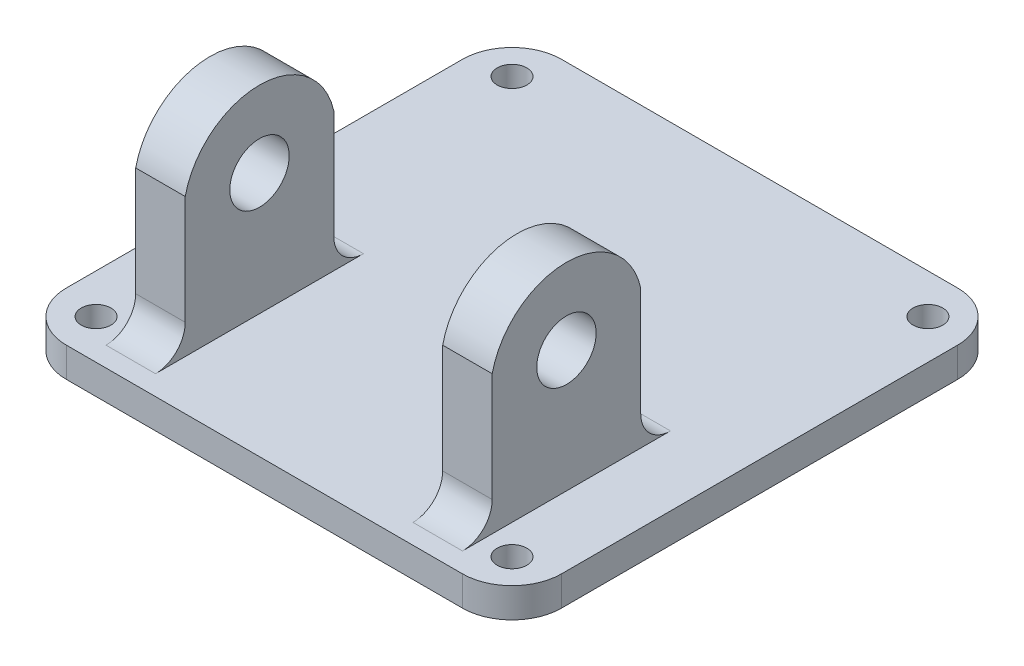
ISO-10303-21;
HEADER;
FILE_DESCRIPTION(('STEP AP214'),'2;1');
FILE_NAME('part.step','',(''),(''),'','','');
FILE_SCHEMA(('AUTOMOTIVE_DESIGN { 1 0 10303 214 1 1 1 1 }'));
ENDSEC;
DATA;
#1=APPLICATION_CONTEXT('core data for automotive mechanical design processes');
#2=APPLICATION_PROTOCOL_DEFINITION('international standard','automotive_design',2000,#1);
#3=PRODUCT_CONTEXT('',#1,'mechanical');
#4=PRODUCT('Part','Part','',(#3));
#5=PRODUCT_RELATED_PRODUCT_CATEGORY('part','',(#4));
#6=PRODUCT_DEFINITION_FORMATION('','',#4);
#7=PRODUCT_DEFINITION_CONTEXT('part definition',#1,'design');
#8=PRODUCT_DEFINITION('design','',#6,#7);
#9=PRODUCT_DEFINITION_SHAPE('','',#8);
#10=(LENGTH_UNIT() NAMED_UNIT(*) SI_UNIT(.MILLI.,.METRE.));
#11=(NAMED_UNIT(*) PLANE_ANGLE_UNIT() SI_UNIT($,.RADIAN.));
#12=(NAMED_UNIT(*) SI_UNIT($,.STERADIAN.) SOLID_ANGLE_UNIT());
#13=UNCERTAINTY_MEASURE_WITH_UNIT(LENGTH_MEASURE(1.E-05),#10,'distance_accuracy_value','');
#14=(GEOMETRIC_REPRESENTATION_CONTEXT(3) GLOBAL_UNCERTAINTY_ASSIGNED_CONTEXT((#13)) GLOBAL_UNIT_ASSIGNED_CONTEXT((#10,
#11,#12)) REPRESENTATION_CONTEXT('',''));
#15=CARTESIAN_POINT('',(0.,0.,0.));
#16=DIRECTION('',(0.,0.,1.));
#17=DIRECTION('',(1.,0.,0.));
#18=AXIS2_PLACEMENT_3D('',#15,#16,#17);
#19=CARTESIAN_POINT('',(13.,6.,2.));
#20=DIRECTION('',(1.,0.,0.));
#21=DIRECTION('',(0.,0.,-1.));
#22=AXIS2_PLACEMENT_3D('',#19,#20,#21);
#23=CYLINDRICAL_SURFACE('',#22,3.);
#24=DIRECTION('',(-1.,0.,0.));
#25=VECTOR('',#24,1.);
#26=CARTESIAN_POINT('',(13.,6.,5.));
#27=LINE('',#26,#25);
#28=CARTESIAN_POINT('',(18.,6.,5.));
#29=VERTEX_POINT('',#28);
#30=CARTESIAN_POINT('',(13.,6.,5.));
#31=VERTEX_POINT('',#30);
#32=EDGE_CURVE('E635',#29,#31,#27,.T.);
#33=ORIENTED_EDGE('',*,*,#32,.F.);
#34=CARTESIAN_POINT('',(18.,6.,2.));
#35=DIRECTION('',(-1.,0.,0.));
#36=DIRECTION('',(0.,0.,1.));
#37=AXIS2_PLACEMENT_3D('',#34,#35,#36);
#38=CIRCLE('',#37,3.);
#39=CARTESIAN_POINT('',(18.,3.,2.));
#40=VERTEX_POINT('',#39);
#41=EDGE_CURVE('E56',#29,#40,#38,.F.);
#42=ORIENTED_EDGE('',*,*,#41,.T.);
#43=DIRECTION('',(-1.,0.,0.));
#44=VECTOR('',#43,1.);
#45=CARTESIAN_POINT('',(13.,3.,2.));
#46=LINE('',#45,#44);
#47=CARTESIAN_POINT('',(13.,3.,2.));
#48=VERTEX_POINT('',#47);
#49=EDGE_CURVE('E637',#48,#40,#46,.F.);
#50=ORIENTED_EDGE('',*,*,#49,.F.);
#51=CARTESIAN_POINT('',(13.,6.,2.));
#52=DIRECTION('',(1.,0.,0.));
#53=DIRECTION('',(0.,0.,-1.));
#54=AXIS2_PLACEMENT_3D('',#51,#52,#53);
#55=CIRCLE('',#54,3.);
#56=EDGE_CURVE('E12',#48,#31,#55,.F.);
#57=ORIENTED_EDGE('',*,*,#56,.T.);
#58=EDGE_LOOP('',(#33,#42,#50,#57));
#59=FACE_BOUND('',#58,.T.);
#60=ADVANCED_FACE('F49',(#59),#23,.F.);
#61=CARTESIAN_POINT('',(8.00000000000007,6.,20.));
#62=CARTESIAN_POINT('',(9.66666666666689,6.,20.));
#63=CARTESIAN_POINT('',(11.3333333333331,6.,20.));
#64=CARTESIAN_POINT('',(14.6666666666669,6.,20.));
#65=CARTESIAN_POINT('',(16.3333333333315,6.,20.));
#66=CARTESIAN_POINT('',(19.6666666666685,6.,20.));
#67=CARTESIAN_POINT('',(21.3333333333319,6.,20.));
#68=CARTESIAN_POINT('',(23.,6.,20.));
#69=CARTESIAN_POINT('',(8.00000000000007,3.,20.));
#70=CARTESIAN_POINT('',(9.66666666666689,3.,20.));
#71=CARTESIAN_POINT('',(11.3333333333331,3.,20.));
#72=CARTESIAN_POINT('',(14.6666666666669,3.,20.));
#73=CARTESIAN_POINT('',(16.3333333333315,3.,20.));
#74=CARTESIAN_POINT('',(19.6666666666685,3.,20.));
#75=CARTESIAN_POINT('',(21.3333333333319,3.,20.));
#76=CARTESIAN_POINT('',(23.,3.,20.));
#77=CARTESIAN_POINT('',(8.00000000000007,3.,23.));
#78=CARTESIAN_POINT('',(9.66666666666688,3.,23.));
#79=CARTESIAN_POINT('',(11.3333333333331,3.,23.));
#80=CARTESIAN_POINT('',(14.6666666666669,3.,23.));
#81=CARTESIAN_POINT('',(16.3333333333315,3.,23.));
#82=CARTESIAN_POINT('',(19.6666666666685,3.,23.));
#83=CARTESIAN_POINT('',(21.3333333333319,3.,23.));
#84=CARTESIAN_POINT('',(22.9999999999999,3.,23.));
#85=(BOUNDED_SURFACE() B_SPLINE_SURFACE(2,3,((#61,#62,#63,#64,#65,#66,#67,#68),(#69,#70,#71,#72,
#73,#74,#75,#76),(#77,#78,#79,#80,#81,#82,#83,#84)),.UNSPECIFIED.,.F.,.F.,
.F.) B_SPLINE_SURFACE_WITH_KNOTS((3,3),(4,2,2,4),(0.,1.),(-1.,0.,1.,2.),
.UNSPECIFIED.) GEOMETRIC_REPRESENTATION_ITEM() RATIONAL_B_SPLINE_SURFACE(((1.,1.,1.,1.,1.,1.,1.,
1.),(0.707106781186548,0.707106781186548,0.707106781186548,0.707106781186548,0.707106781186548,
0.707106781186548,0.707106781186548,0.707106781186548),(1.,1.,1.,1.,1.,1.,1.,1.))) REPRESENTATION_ITEM('') SURFACE());
#86=CARTESIAN_POINT('',(23.,6.,20.));
#87=CARTESIAN_POINT('',(21.3333333333319,6.,20.));
#88=CARTESIAN_POINT('',(19.6666666666685,6.,20.));
#89=CARTESIAN_POINT('',(16.3333333333315,6.,20.));
#90=CARTESIAN_POINT('',(14.6666666666669,6.,20.));
#91=CARTESIAN_POINT('',(11.3333333333331,6.,20.));
#92=CARTESIAN_POINT('',(9.66666666666689,6.,20.));
#93=CARTESIAN_POINT('',(8.00000000000007,6.,20.));
#94=(BOUNDED_CURVE() B_SPLINE_CURVE(3,(#86,#87,#88,#89,#90,#91,#92,#93),.UNSPECIFIED.,.F.,
.F.) B_SPLINE_CURVE_WITH_KNOTS((4,2,2,4),(-1.,0.,1.,2.),
.UNSPECIFIED.) CURVE() GEOMETRIC_REPRESENTATION_ITEM() RATIONAL_B_SPLINE_CURVE((1.,1.,1.,1.,1.,
1.,1.,1.)) REPRESENTATION_ITEM(''));
#95=CARTESIAN_POINT('',(13.,6.,20.));
#96=VERTEX_POINT('',#95);
#97=CARTESIAN_POINT('',(18.,6.,20.));
#98=VERTEX_POINT('',#97);
#99=EDGE_CURVE('E237',#96,#98,#94,.F.);
#100=CARTESIAN_POINT('',(13.,6.,20.));
#101=CARTESIAN_POINT('',(13.,3.,20.));
#102=CARTESIAN_POINT('',(13.,3.,23.));
#103=(BOUNDED_CURVE() B_SPLINE_CURVE(2,(#100,#101,#102),.UNSPECIFIED.,.F.,
.F.) B_SPLINE_CURVE_WITH_KNOTS((3,3),(0.,1.),
.UNSPECIFIED.) CURVE() GEOMETRIC_REPRESENTATION_ITEM() RATIONAL_B_SPLINE_CURVE((1.,
0.707106781186547,1.)) REPRESENTATION_ITEM(''));
#104=CARTESIAN_POINT('',(13.,3.,23.));
#105=VERTEX_POINT('',#104);
#106=EDGE_CURVE('E325',#96,#105,#103,.T.);
#107=CARTESIAN_POINT('',(8.00000000000007,3.,23.));
#108=CARTESIAN_POINT('',(9.66666666666688,3.,23.));
#109=CARTESIAN_POINT('',(11.3333333333331,3.,23.));
#110=CARTESIAN_POINT('',(14.6666666666669,3.,23.));
#111=CARTESIAN_POINT('',(16.3333333333315,3.,23.));
#112=CARTESIAN_POINT('',(19.6666666666685,3.,23.));
#113=CARTESIAN_POINT('',(21.3333333333319,3.,23.));
#114=CARTESIAN_POINT('',(22.9999999999999,3.,23.));
#115=(BOUNDED_CURVE() B_SPLINE_CURVE(3,(#107,#108,#109,#110,#111,#112,#113,#114),.UNSPECIFIED.,
.F.,.F.) B_SPLINE_CURVE_WITH_KNOTS((4,2,2,4),(-1.,0.,1.,2.),
.UNSPECIFIED.) CURVE() GEOMETRIC_REPRESENTATION_ITEM() RATIONAL_B_SPLINE_CURVE((1.,1.,1.,1.,1.,
1.,1.,1.)) REPRESENTATION_ITEM(''));
#116=CARTESIAN_POINT('',(18.,3.,23.));
#117=VERTEX_POINT('',#116);
#118=EDGE_CURVE('E326',#117,#105,#115,.F.);
#119=CARTESIAN_POINT('',(18.,3.,23.));
#120=CARTESIAN_POINT('',(18.,3.,20.));
#121=CARTESIAN_POINT('',(18.,6.,20.));
#122=(BOUNDED_CURVE() B_SPLINE_CURVE(2,(#119,#120,#121),.UNSPECIFIED.,.F.,
.F.) B_SPLINE_CURVE_WITH_KNOTS((3,3),(0.,1.),
.UNSPECIFIED.) CURVE() GEOMETRIC_REPRESENTATION_ITEM() RATIONAL_B_SPLINE_CURVE((1.,
0.707106781186548,1.)) REPRESENTATION_ITEM(''));
#123=EDGE_CURVE('E278',#117,#98,#122,.T.);
#124=ORIENTED_EDGE('',*,*,#99,.F.);
#125=ORIENTED_EDGE('',*,*,#106,.T.);
#126=ORIENTED_EDGE('',*,*,#118,.F.);
#127=ORIENTED_EDGE('',*,*,#123,.T.);
#128=EDGE_LOOP('',(#124,#125,#126,#127));
#129=FACE_BOUND('',#128,.T.);
#130=ADVANCED_FACE('F284',(#129),#85,.T.);
#131=CARTESIAN_POINT('',(-13.,6.,2.));
#132=DIRECTION('',(1.,0.,0.));
#133=DIRECTION('',(0.,0.,-1.));
#134=AXIS2_PLACEMENT_3D('',#131,#132,#133);
#135=CYLINDRICAL_SURFACE('',#134,3.);
#136=DIRECTION('',(-1.,0.,0.));
#137=VECTOR('',#136,1.);
#138=CARTESIAN_POINT('',(-13.,6.,5.));
#139=LINE('',#138,#137);
#140=CARTESIAN_POINT('',(-13.,6.,5.));
#141=VERTEX_POINT('',#140);
#142=CARTESIAN_POINT('',(-18.,6.,5.));
#143=VERTEX_POINT('',#142);
#144=EDGE_CURVE('E339',#141,#143,#139,.T.);
#145=ORIENTED_EDGE('',*,*,#144,.F.);
#146=CARTESIAN_POINT('',(-13.,6.,2.));
#147=DIRECTION('',(-1.,0.,0.));
#148=DIRECTION('',(0.,0.,1.));
#149=AXIS2_PLACEMENT_3D('',#146,#147,#148);
#150=CIRCLE('',#149,3.);
#151=CARTESIAN_POINT('',(-13.,3.,2.));
#152=VERTEX_POINT('',#151);
#153=EDGE_CURVE('E330',#141,#152,#150,.F.);
#154=ORIENTED_EDGE('',*,*,#153,.T.);
#155=DIRECTION('',(-1.,0.,0.));
#156=VECTOR('',#155,1.);
#157=CARTESIAN_POINT('',(-13.,3.,2.));
#158=LINE('',#157,#156);
#159=CARTESIAN_POINT('',(-18.,3.,2.));
#160=VERTEX_POINT('',#159);
#161=EDGE_CURVE('E337',#160,#152,#158,.F.);
#162=ORIENTED_EDGE('',*,*,#161,.F.);
#163=CARTESIAN_POINT('',(-18.,6.,2.));
#164=DIRECTION('',(1.,0.,0.));
#165=DIRECTION('',(0.,0.,-1.));
#166=AXIS2_PLACEMENT_3D('',#163,#164,#165);
#167=CIRCLE('',#166,3.);
#168=EDGE_CURVE('E228',#160,#143,#167,.F.);
#169=ORIENTED_EDGE('',*,*,#168,.T.);
#170=EDGE_LOOP('',(#145,#154,#162,#169));
#171=FACE_BOUND('',#170,.T.);
#172=ADVANCED_FACE('F298',(#171),#135,.F.);
#173=CARTESIAN_POINT('',(-23.,6.,20.));
#174=CARTESIAN_POINT('',(-21.3333333333342,6.,20.));
#175=CARTESIAN_POINT('',(-19.6666666666654,6.,20.));
#176=CARTESIAN_POINT('',(-16.3333333333345,6.,20.));
#177=CARTESIAN_POINT('',(-14.6666666666656,6.,20.));
#178=CARTESIAN_POINT('',(-11.3333333333344,6.,20.));
#179=CARTESIAN_POINT('',(-9.66666666666588,6.,20.));
#180=CARTESIAN_POINT('',(-8.,6.,20.));
#181=CARTESIAN_POINT('',(-23.,3.,20.));
#182=CARTESIAN_POINT('',(-21.3333333333321,3.,20.));
#183=CARTESIAN_POINT('',(-19.6666666666683,3.,20.));
#184=CARTESIAN_POINT('',(-16.3333333333317,3.,20.));
#185=CARTESIAN_POINT('',(-14.6666666666627,3.,20.));
#186=CARTESIAN_POINT('',(-11.3333333333373,3.,20.));
#187=CARTESIAN_POINT('',(-9.66666666666371,3.,20.));
#188=CARTESIAN_POINT('',(-8.,3.,20.));
#189=CARTESIAN_POINT('',(-23.,3.,23.));
#190=CARTESIAN_POINT('',(-21.3333333333321,3.,23.));
#191=CARTESIAN_POINT('',(-19.6666666666683,3.,23.));
#192=CARTESIAN_POINT('',(-16.3333333333316,3.,23.));
#193=CARTESIAN_POINT('',(-14.6666666666627,3.,23.));
#194=CARTESIAN_POINT('',(-11.3333333333373,3.,23.));
#195=CARTESIAN_POINT('',(-9.66666666666371,3.,23.));
#196=CARTESIAN_POINT('',(-8.,3.,23.));
#197=(BOUNDED_SURFACE() B_SPLINE_SURFACE(2,3,((#173,#174,#175,#176,#177,#178,#179,#180),(#181,
#182,#183,#184,#185,#186,#187,#188),(#189,#190,#191,#192,#193,#194,#195,#196)),.UNSPECIFIED.,
.F.,.F.,.F.) B_SPLINE_SURFACE_WITH_KNOTS((3,3),(4,2,2,4),(0.,1.),(-1.,0.,1.,2.),
.UNSPECIFIED.) GEOMETRIC_REPRESENTATION_ITEM() RATIONAL_B_SPLINE_SURFACE(((1.,1.,1.,1.,1.,1.,1.,
1.),(0.707106781186548,0.707106781186548,0.707106781186548,0.707106781186548,0.707106781186548,
0.707106781186548,0.707106781186548,0.707106781186548),(1.,1.,1.,1.,1.,1.,1.,1.))) REPRESENTATION_ITEM('') SURFACE());
#198=CARTESIAN_POINT('',(-8.,6.,20.));
#199=CARTESIAN_POINT('',(-9.66666666666588,6.,20.));
#200=CARTESIAN_POINT('',(-11.3333333333344,6.,20.));
#201=CARTESIAN_POINT('',(-14.6666666666656,6.,20.));
#202=CARTESIAN_POINT('',(-16.3333333333345,6.,20.));
#203=CARTESIAN_POINT('',(-19.6666666666654,6.,20.));
#204=CARTESIAN_POINT('',(-21.3333333333342,6.,20.));
#205=CARTESIAN_POINT('',(-23.,6.,20.));
#206=(BOUNDED_CURVE() B_SPLINE_CURVE(3,(#198,#199,#200,#201,#202,#203,#204,#205),.UNSPECIFIED.,
.F.,.F.) B_SPLINE_CURVE_WITH_KNOTS((4,2,2,4),(-1.,0.,1.,2.),
.UNSPECIFIED.) CURVE() GEOMETRIC_REPRESENTATION_ITEM() RATIONAL_B_SPLINE_CURVE((1.,1.,1.,1.,1.,
1.,1.,1.)) REPRESENTATION_ITEM(''));
#207=CARTESIAN_POINT('',(-18.,6.,20.));
#208=VERTEX_POINT('',#207);
#209=CARTESIAN_POINT('',(-13.,6.,20.));
#210=VERTEX_POINT('',#209);
#211=EDGE_CURVE('E485',#208,#210,#206,.F.);
#212=CARTESIAN_POINT('',(-18.,6.,20.));
#213=CARTESIAN_POINT('',(-18.,3.,20.));
#214=CARTESIAN_POINT('',(-18.,3.,23.));
#215=(BOUNDED_CURVE() B_SPLINE_CURVE(2,(#212,#213,#214),.UNSPECIFIED.,.F.,
.F.) B_SPLINE_CURVE_WITH_KNOTS((3,3),(0.,1.),
.UNSPECIFIED.) CURVE() GEOMETRIC_REPRESENTATION_ITEM() RATIONAL_B_SPLINE_CURVE((1.,
0.707106781186548,1.)) REPRESENTATION_ITEM(''));
#216=CARTESIAN_POINT('',(-18.,3.,23.));
#217=VERTEX_POINT('',#216);
#218=EDGE_CURVE('E484',#208,#217,#215,.T.);
#219=CARTESIAN_POINT('',(-23.,3.,23.));
#220=CARTESIAN_POINT('',(-21.3333333333321,3.,23.));
#221=CARTESIAN_POINT('',(-19.6666666666683,3.,23.));
#222=CARTESIAN_POINT('',(-16.3333333333316,3.,23.));
#223=CARTESIAN_POINT('',(-14.6666666666627,3.,23.));
#224=CARTESIAN_POINT('',(-11.3333333333373,3.,23.));
#225=CARTESIAN_POINT('',(-9.66666666666371,3.,23.));
#226=CARTESIAN_POINT('',(-8.,3.,23.));
#227=(BOUNDED_CURVE() B_SPLINE_CURVE(3,(#219,#220,#221,#222,#223,#224,#225,#226),.UNSPECIFIED.,
.F.,.F.) B_SPLINE_CURVE_WITH_KNOTS((4,2,2,4),(-1.,0.,1.,2.),
.UNSPECIFIED.) CURVE() GEOMETRIC_REPRESENTATION_ITEM() RATIONAL_B_SPLINE_CURVE((1.,1.,1.,1.,1.,
1.,1.,1.)) REPRESENTATION_ITEM(''));
#228=CARTESIAN_POINT('',(-13.,3.,23.));
#229=VERTEX_POINT('',#228);
#230=EDGE_CURVE('E390',#229,#217,#227,.F.);
#231=CARTESIAN_POINT('',(-13.,3.,23.));
#232=CARTESIAN_POINT('',(-13.,3.,20.));
#233=CARTESIAN_POINT('',(-13.,6.,20.));
#234=(BOUNDED_CURVE() B_SPLINE_CURVE(2,(#231,#232,#233),.UNSPECIFIED.,.F.,
.F.) B_SPLINE_CURVE_WITH_KNOTS((3,3),(0.,1.),
.UNSPECIFIED.) CURVE() GEOMETRIC_REPRESENTATION_ITEM() RATIONAL_B_SPLINE_CURVE((1.,
0.707106781186548,1.)) REPRESENTATION_ITEM(''));
#235=EDGE_CURVE('E343',#229,#210,#234,.T.);
#236=ORIENTED_EDGE('',*,*,#211,.F.);
#237=ORIENTED_EDGE('',*,*,#218,.T.);
#238=ORIENTED_EDGE('',*,*,#230,.F.);
#239=ORIENTED_EDGE('',*,*,#235,.T.);
#240=EDGE_LOOP('',(#236,#237,#238,#239));
#241=FACE_BOUND('',#240,.T.);
#242=ADVANCED_FACE('F451',(#241),#197,.T.);
#243=CARTESIAN_POINT('',(-13.,23.,5.));
#244=DIRECTION('',(0.,0.,1.));
#245=DIRECTION('',(1.,0.,0.));
#246=AXIS2_PLACEMENT_3D('',#243,#244,#245);
#247=PLANE('',#246);
#248=DIRECTION('',(0.,-1.,0.));
#249=VECTOR('',#248,1.);
#250=CARTESIAN_POINT('',(-13.,23.,5.));
#251=LINE('',#250,#249);
#252=CARTESIAN_POINT('',(-13.,17.,5.));
#253=VERTEX_POINT('',#252);
#254=EDGE_CURVE('E509',#253,#141,#251,.T.);
#255=ORIENTED_EDGE('',*,*,#254,.T.);
#256=ORIENTED_EDGE('',*,*,#144,.T.);
#257=DIRECTION('',(0.,-1.,0.));
#258=VECTOR('',#257,1.);
#259=CARTESIAN_POINT('',(-18.,23.,5.));
#260=LINE('',#259,#258);
#261=CARTESIAN_POINT('',(-18.,17.,5.));
#262=VERTEX_POINT('',#261);
#263=EDGE_CURVE('E348',#262,#143,#260,.T.);
#264=ORIENTED_EDGE('',*,*,#263,.F.);
#265=DIRECTION('',(-1.,0.,0.));
#266=VECTOR('',#265,1.);
#267=CARTESIAN_POINT('',(124.196557225107,17.,5.));
#268=LINE('',#267,#266);
#269=EDGE_CURVE('E202',#253,#262,#268,.T.);
#270=ORIENTED_EDGE('',*,*,#269,.F.);
#271=EDGE_LOOP('',(#255,#256,#264,#270));
#272=FACE_BOUND('',#271,.T.);
#273=ADVANCED_FACE('F262',(#272),#247,.F.);
#274=CARTESIAN_POINT('',(13.,23.,5.));
#275=DIRECTION('',(0.,0.,1.));
#276=DIRECTION('',(1.,0.,0.));
#277=AXIS2_PLACEMENT_3D('',#274,#275,#276);
#278=PLANE('',#277);
#279=DIRECTION('',(0.,-1.,0.));
#280=VECTOR('',#279,1.);
#281=CARTESIAN_POINT('',(18.,23.,5.));
#282=LINE('',#281,#280);
#283=CARTESIAN_POINT('',(18.,17.,5.));
#284=VERTEX_POINT('',#283);
#285=EDGE_CURVE('E183',#284,#29,#282,.T.);
#286=ORIENTED_EDGE('',*,*,#285,.T.);
#287=ORIENTED_EDGE('',*,*,#32,.T.);
#288=DIRECTION('',(0.,-1.,0.));
#289=VECTOR('',#288,1.);
#290=CARTESIAN_POINT('',(13.,23.,5.));
#291=LINE('',#290,#289);
#292=CARTESIAN_POINT('',(13.,17.,5.));
#293=VERTEX_POINT('',#292);
#294=EDGE_CURVE('E194',#293,#31,#291,.T.);
#295=ORIENTED_EDGE('',*,*,#294,.F.);
#296=EDGE_CURVE('E198',#284,#293,#268,.T.);
#297=ORIENTED_EDGE('',*,*,#296,.F.);
#298=EDGE_LOOP('',(#286,#287,#295,#297));
#299=FACE_BOUND('',#298,.T.);
#300=ADVANCED_FACE('F199',(#299),#278,.F.);
#301=CARTESIAN_POINT('',(-18.,23.,20.));
#302=DIRECTION('',(1.,0.,0.));
#303=DIRECTION('',(0.,0.,-1.));
#304=AXIS2_PLACEMENT_3D('',#301,#302,#303);
#305=PLANE('',#304);
#306=CARTESIAN_POINT('',(-18.,15.3125,12.5));
#307=DIRECTION('',(1.,0.,0.));
#308=DIRECTION('',(0.,0.,-1.));
#309=AXIS2_PLACEMENT_3D('',#306,#307,#308);
#310=CIRCLE('',#309,3.);
#311=CARTESIAN_POINT('',(-18.,15.3125,9.5));
#312=VERTEX_POINT('',#311);
#313=EDGE_CURVE('E655',#312,#312,#310,.T.);
#314=ORIENTED_EDGE('',*,*,#313,.T.);
#315=EDGE_LOOP('',(#314));
#316=FACE_BOUND('',#315,.T.);
#317=CARTESIAN_POINT('',(-18.,15.3125,12.5));
#318=DIRECTION('',(1.,0.,0.));
#319=DIRECTION('',(0.,0.,-1.));
#320=AXIS2_PLACEMENT_3D('',#317,#318,#319);
#321=CIRCLE('',#320,7.6875);
#322=CARTESIAN_POINT('',(-18.,17.,20.));
#323=VERTEX_POINT('',#322);
#324=EDGE_CURVE('E217',#262,#323,#321,.T.);
#325=ORIENTED_EDGE('',*,*,#324,.F.);
#326=ORIENTED_EDGE('',*,*,#263,.T.);
#327=ORIENTED_EDGE('',*,*,#168,.F.);
#328=DIRECTION('',(0.,0.,1.));
#329=VECTOR('',#328,1.);
#330=CARTESIAN_POINT('',(-18.,3.,20.));
#331=LINE('',#330,#329);
#332=EDGE_CURVE('E232',#160,#217,#331,.T.);
#333=ORIENTED_EDGE('',*,*,#332,.T.);
#334=ORIENTED_EDGE('',*,*,#218,.F.);
#335=DIRECTION('',(0.,-1.,0.));
#336=VECTOR('',#335,1.);
#337=CARTESIAN_POINT('',(-18.,23.,20.));
#338=LINE('',#337,#336);
#339=EDGE_CURVE('E508',#323,#208,#338,.T.);
#340=ORIENTED_EDGE('',*,*,#339,.F.);
#341=EDGE_LOOP('',(#325,#326,#327,#333,#334,#340));
#342=FACE_BOUND('',#341,.T.);
#343=ADVANCED_FACE('F365',(#316,#342),#305,.F.);
#344=CARTESIAN_POINT('',(-13.,23.,20.));
#345=DIRECTION('',(-1.,0.,0.));
#346=DIRECTION('',(0.,0.,1.));
#347=AXIS2_PLACEMENT_3D('',#344,#345,#346);
#348=PLANE('',#347);
#349=CARTESIAN_POINT('',(-13.,15.3125,12.5));
#350=DIRECTION('',(-1.,0.,0.));
#351=DIRECTION('',(0.,0.,1.));
#352=AXIS2_PLACEMENT_3D('',#349,#350,#351);
#353=CIRCLE('',#352,3.);
#354=CARTESIAN_POINT('',(-13.,15.3125,15.5));
#355=VERTEX_POINT('',#354);
#356=EDGE_CURVE('E658',#355,#355,#353,.T.);
#357=ORIENTED_EDGE('',*,*,#356,.T.);
#358=EDGE_LOOP('',(#357));
#359=FACE_BOUND('',#358,.T.);
#360=CARTESIAN_POINT('',(-13.,15.3125,12.5));
#361=DIRECTION('',(-1.,0.,0.));
#362=DIRECTION('',(0.,0.,1.));
#363=AXIS2_PLACEMENT_3D('',#360,#361,#362);
#364=CIRCLE('',#363,7.6875);
#365=CARTESIAN_POINT('',(-13.,17.,20.));
#366=VERTEX_POINT('',#365);
#367=EDGE_CURVE('E210',#366,#253,#364,.T.);
#368=ORIENTED_EDGE('',*,*,#367,.F.);
#369=DIRECTION('',(0.,-1.,0.));
#370=VECTOR('',#369,1.);
#371=CARTESIAN_POINT('',(-13.,23.,20.));
#372=LINE('',#371,#370);
#373=EDGE_CURVE('E506',#366,#210,#372,.T.);
#374=ORIENTED_EDGE('',*,*,#373,.T.);
#375=ORIENTED_EDGE('',*,*,#235,.F.);
#376=DIRECTION('',(0.,0.,-1.));
#377=VECTOR('',#376,1.);
#378=CARTESIAN_POINT('',(-13.,3.,20.));
#379=LINE('',#378,#377);
#380=EDGE_CURVE('E346',#229,#152,#379,.T.);
#381=ORIENTED_EDGE('',*,*,#380,.T.);
#382=ORIENTED_EDGE('',*,*,#153,.F.);
#383=ORIENTED_EDGE('',*,*,#254,.F.);
#384=EDGE_LOOP('',(#368,#374,#375,#381,#382,#383));
#385=FACE_BOUND('',#384,.T.);
#386=ADVANCED_FACE('F260',(#359,#385),#348,.F.);
#387=CARTESIAN_POINT('',(13.,23.,20.));
#388=DIRECTION('',(1.,0.,0.));
#389=DIRECTION('',(0.,0.,-1.));
#390=AXIS2_PLACEMENT_3D('',#387,#388,#389);
#391=PLANE('',#390);
#392=CARTESIAN_POINT('',(13.,15.3125,12.5));
#393=DIRECTION('',(1.,0.,0.));
#394=DIRECTION('',(0.,0.,-1.));
#395=AXIS2_PLACEMENT_3D('',#392,#393,#394);
#396=CIRCLE('',#395,3.);
#397=CARTESIAN_POINT('',(13.,15.3125,9.5));
#398=VERTEX_POINT('',#397);
#399=EDGE_CURVE('E505',#398,#398,#396,.T.);
#400=ORIENTED_EDGE('',*,*,#399,.T.);
#401=EDGE_LOOP('',(#400));
#402=FACE_BOUND('',#401,.T.);
#403=CARTESIAN_POINT('',(13.,15.3125,12.5));
#404=DIRECTION('',(1.,0.,0.));
#405=DIRECTION('',(0.,0.,-1.));
#406=AXIS2_PLACEMENT_3D('',#403,#404,#405);
#407=CIRCLE('',#406,7.6875);
#408=CARTESIAN_POINT('',(13.,17.,20.));
#409=VERTEX_POINT('',#408);
#410=EDGE_CURVE('E208',#293,#409,#407,.T.);
#411=ORIENTED_EDGE('',*,*,#410,.F.);
#412=ORIENTED_EDGE('',*,*,#294,.T.);
#413=ORIENTED_EDGE('',*,*,#56,.F.);
#414=DIRECTION('',(0.,0.,1.));
#415=VECTOR('',#414,1.);
#416=CARTESIAN_POINT('',(13.,3.,20.));
#417=LINE('',#416,#415);
#418=EDGE_CURVE('E71',#48,#105,#417,.T.);
#419=ORIENTED_EDGE('',*,*,#418,.T.);
#420=ORIENTED_EDGE('',*,*,#106,.F.);
#421=DIRECTION('',(0.,-1.,0.));
#422=VECTOR('',#421,1.);
#423=CARTESIAN_POINT('',(13.,23.,20.));
#424=LINE('',#423,#422);
#425=EDGE_CURVE('E227',#409,#96,#424,.T.);
#426=ORIENTED_EDGE('',*,*,#425,.F.);
#427=EDGE_LOOP('',(#411,#412,#413,#419,#420,#426));
#428=FACE_BOUND('',#427,.T.);
#429=ADVANCED_FACE('F256',(#402,#428),#391,.F.);
#430=CARTESIAN_POINT('',(18.,23.,20.));
#431=DIRECTION('',(-1.,0.,0.));
#432=DIRECTION('',(0.,0.,1.));
#433=AXIS2_PLACEMENT_3D('',#430,#431,#432);
#434=PLANE('',#433);
#435=CARTESIAN_POINT('',(18.,15.3125,12.5));
#436=DIRECTION('',(-1.,0.,0.));
#437=DIRECTION('',(0.,0.,1.));
#438=AXIS2_PLACEMENT_3D('',#435,#436,#437);
#439=CIRCLE('',#438,3.);
#440=CARTESIAN_POINT('',(18.,15.3125,15.5));
#441=VERTEX_POINT('',#440);
#442=EDGE_CURVE('E502',#441,#441,#439,.T.);
#443=ORIENTED_EDGE('',*,*,#442,.T.);
#444=EDGE_LOOP('',(#443));
#445=FACE_BOUND('',#444,.T.);
#446=CARTESIAN_POINT('',(18.,15.3125,12.5));
#447=DIRECTION('',(-1.,0.,0.));
#448=DIRECTION('',(0.,0.,1.));
#449=AXIS2_PLACEMENT_3D('',#446,#447,#448);
#450=CIRCLE('',#449,7.6875);
#451=CARTESIAN_POINT('',(18.,17.,20.));
#452=VERTEX_POINT('',#451);
#453=EDGE_CURVE('E188',#452,#284,#450,.T.);
#454=ORIENTED_EDGE('',*,*,#453,.F.);
#455=DIRECTION('',(0.,-1.,0.));
#456=VECTOR('',#455,1.);
#457=CARTESIAN_POINT('',(18.,23.,20.));
#458=LINE('',#457,#456);
#459=EDGE_CURVE('E193',#452,#98,#458,.T.);
#460=ORIENTED_EDGE('',*,*,#459,.T.);
#461=ORIENTED_EDGE('',*,*,#123,.F.);
#462=DIRECTION('',(0.,0.,-1.));
#463=VECTOR('',#462,1.);
#464=CARTESIAN_POINT('',(18.,3.,20.));
#465=LINE('',#464,#463);
#466=EDGE_CURVE('E63',#117,#40,#465,.T.);
#467=ORIENTED_EDGE('',*,*,#466,.T.);
#468=ORIENTED_EDGE('',*,*,#41,.F.);
#469=ORIENTED_EDGE('',*,*,#285,.F.);
#470=EDGE_LOOP('',(#454,#460,#461,#467,#468,#469));
#471=FACE_BOUND('',#470,.T.);
#472=ADVANCED_FACE('F185',(#445,#471),#434,.F.);
#473=CARTESIAN_POINT('',(20.,3.,20.));
#474=DIRECTION('',(0.,-1.,0.));
#475=DIRECTION('',(0.,0.,-1.));
#476=AXIS2_PLACEMENT_3D('',#473,#474,#475);
#477=PLANE('',#476);
#478=ORIENTED_EDGE('',*,*,#161,.T.);
#479=ORIENTED_EDGE('',*,*,#380,.F.);
#480=ORIENTED_EDGE('',*,*,#230,.T.);
#481=ORIENTED_EDGE('',*,*,#332,.F.);
#482=EDGE_LOOP('',(#478,#479,#480,#481));
#483=FACE_BOUND('',#482,.T.);
#484=CARTESIAN_POINT('',(20.,3.,20.));
#485=DIRECTION('',(0.,1.,0.));
#486=DIRECTION('',(0.,0.,-1.));
#487=AXIS2_PLACEMENT_3D('',#484,#485,#486);
#488=CIRCLE('',#487,5.);
#489=CARTESIAN_POINT('',(20.,3.,25.));
#490=VERTEX_POINT('',#489);
#491=CARTESIAN_POINT('',(25.,3.,20.));
#492=VERTEX_POINT('',#491);
#493=EDGE_CURVE('E540',#490,#492,#488,.T.);
#494=ORIENTED_EDGE('',*,*,#493,.T.);
#495=DIRECTION('',(0.,0.,-1.));
#496=VECTOR('',#495,1.);
#497=CARTESIAN_POINT('',(25.,3.,-20.));
#498=LINE('',#497,#496);
#499=CARTESIAN_POINT('',(25.,3.,-20.));
#500=VERTEX_POINT('',#499);
#501=EDGE_CURVE('E543',#492,#500,#498,.T.);
#502=ORIENTED_EDGE('',*,*,#501,.T.);
#503=CARTESIAN_POINT('',(20.,3.,-20.));
#504=DIRECTION('',(0.,1.,0.));
#505=DIRECTION('',(0.,0.,1.));
#506=AXIS2_PLACEMENT_3D('',#503,#504,#505);
#507=CIRCLE('',#506,5.);
#508=CARTESIAN_POINT('',(20.,3.,-25.));
#509=VERTEX_POINT('',#508);
#510=EDGE_CURVE('E546',#500,#509,#507,.T.);
#511=ORIENTED_EDGE('',*,*,#510,.T.);
#512=DIRECTION('',(-1.,0.,0.));
#513=VECTOR('',#512,1.);
#514=CARTESIAN_POINT('',(-20.,3.,-25.));
#515=LINE('',#514,#513);
#516=CARTESIAN_POINT('',(-20.,3.,-25.));
#517=VERTEX_POINT('',#516);
#518=EDGE_CURVE('E548',#509,#517,#515,.T.);
#519=ORIENTED_EDGE('',*,*,#518,.T.);
#520=CARTESIAN_POINT('',(-20.,3.,-20.));
#521=DIRECTION('',(0.,1.,0.));
#522=DIRECTION('',(0.,0.,-1.));
#523=AXIS2_PLACEMENT_3D('',#520,#521,#522);
#524=CIRCLE('',#523,5.);
#525=CARTESIAN_POINT('',(-25.,3.,-20.));
#526=VERTEX_POINT('',#525);
#527=EDGE_CURVE('E550',#517,#526,#524,.T.);
#528=ORIENTED_EDGE('',*,*,#527,.T.);
#529=DIRECTION('',(0.,0.,1.));
#530=VECTOR('',#529,1.);
#531=CARTESIAN_POINT('',(-25.,3.,-20.));
#532=LINE('',#531,#530);
#533=CARTESIAN_POINT('',(-25.,3.,20.));
#534=VERTEX_POINT('',#533);
#535=EDGE_CURVE('E552',#526,#534,#532,.T.);
#536=ORIENTED_EDGE('',*,*,#535,.T.);
#537=CARTESIAN_POINT('',(-20.,3.,20.));
#538=DIRECTION('',(0.,1.,0.));
#539=DIRECTION('',(0.,0.,-1.));
#540=AXIS2_PLACEMENT_3D('',#537,#538,#539);
#541=CIRCLE('',#540,5.);
#542=CARTESIAN_POINT('',(-20.,3.,25.));
#543=VERTEX_POINT('',#542);
#544=EDGE_CURVE('E554',#534,#543,#541,.T.);
#545=ORIENTED_EDGE('',*,*,#544,.T.);
#546=DIRECTION('',(1.,0.,0.));
#547=VECTOR('',#546,1.);
#548=CARTESIAN_POINT('',(-20.,3.,25.));
#549=LINE('',#548,#547);
#550=EDGE_CURVE('E556',#543,#490,#549,.T.);
#551=ORIENTED_EDGE('',*,*,#550,.T.);
#552=EDGE_LOOP('',(#494,#502,#511,#519,#528,#536,#545,#551));
#553=FACE_BOUND('',#552,.T.);
#554=CARTESIAN_POINT('',(-21.,3.,-21.));
#555=DIRECTION('',(0.,1.,0.));
#556=DIRECTION('',(0.,0.,1.));
#557=AXIS2_PLACEMENT_3D('',#554,#555,#556);
#558=CIRCLE('',#557,1.5);
#559=CARTESIAN_POINT('',(-21.,3.,-19.5));
#560=VERTEX_POINT('',#559);
#561=EDGE_CURVE('E534',#560,#560,#558,.T.);
#562=ORIENTED_EDGE('',*,*,#561,.F.);
#563=EDGE_LOOP('',(#562));
#564=FACE_BOUND('',#563,.T.);
#565=CARTESIAN_POINT('',(21.,3.,-21.));
#566=DIRECTION('',(0.,1.,0.));
#567=DIRECTION('',(0.,0.,1.));
#568=AXIS2_PLACEMENT_3D('',#565,#566,#567);
#569=CIRCLE('',#568,1.5);
#570=CARTESIAN_POINT('',(21.,3.,-19.5));
#571=VERTEX_POINT('',#570);
#572=EDGE_CURVE('E528',#571,#571,#569,.T.);
#573=ORIENTED_EDGE('',*,*,#572,.F.);
#574=EDGE_LOOP('',(#573));
#575=FACE_BOUND('',#574,.T.);
#576=CARTESIAN_POINT('',(21.,3.,21.));
#577=DIRECTION('',(0.,1.,0.));
#578=DIRECTION('',(0.,0.,1.));
#579=AXIS2_PLACEMENT_3D('',#576,#577,#578);
#580=CIRCLE('',#579,1.5);
#581=CARTESIAN_POINT('',(21.,3.,22.5));
#582=VERTEX_POINT('',#581);
#583=EDGE_CURVE('E522',#582,#582,#580,.T.);
#584=ORIENTED_EDGE('',*,*,#583,.F.);
#585=EDGE_LOOP('',(#584));
#586=FACE_BOUND('',#585,.T.);
#587=CARTESIAN_POINT('',(-21.,3.,21.));
#588=DIRECTION('',(0.,1.,0.));
#589=DIRECTION('',(0.,0.,1.));
#590=AXIS2_PLACEMENT_3D('',#587,#588,#589);
#591=CIRCLE('',#590,1.5);
#592=CARTESIAN_POINT('',(-21.,3.,22.5));
#593=VERTEX_POINT('',#592);
#594=EDGE_CURVE('E515',#593,#593,#591,.T.);
#595=ORIENTED_EDGE('',*,*,#594,.F.);
#596=EDGE_LOOP('',(#595));
#597=FACE_BOUND('',#596,.T.);
#598=ORIENTED_EDGE('',*,*,#49,.T.);
#599=ORIENTED_EDGE('',*,*,#466,.F.);
#600=ORIENTED_EDGE('',*,*,#118,.T.);
#601=ORIENTED_EDGE('',*,*,#418,.F.);
#602=EDGE_LOOP('',(#598,#599,#600,#601));
#603=FACE_BOUND('',#602,.T.);
#604=ADVANCED_FACE('F329',(#483,#553,#564,#575,#586,#597,#603),#477,.F.);
#605=CARTESIAN_POINT('',(20.,0.,20.));
#606=DIRECTION('',(0.,-1.,0.));
#607=DIRECTION('',(0.,0.,-1.));
#608=AXIS2_PLACEMENT_3D('',#605,#606,#607);
#609=PLANE('',#608);
#610=CARTESIAN_POINT('',(21.,0.,21.));
#611=DIRECTION('',(0.,1.,0.));
#612=DIRECTION('',(0.,0.,1.));
#613=AXIS2_PLACEMENT_3D('',#610,#611,#612);
#614=CIRCLE('',#613,1.5);
#615=CARTESIAN_POINT('',(21.,0.,22.5));
#616=VERTEX_POINT('',#615);
#617=EDGE_CURVE('E518',#616,#616,#614,.T.);
#618=ORIENTED_EDGE('',*,*,#617,.T.);
#619=EDGE_LOOP('',(#618));
#620=FACE_BOUND('',#619,.T.);
#621=CARTESIAN_POINT('',(-21.,0.,-21.));
#622=DIRECTION('',(0.,1.,0.));
#623=DIRECTION('',(0.,0.,1.));
#624=AXIS2_PLACEMENT_3D('',#621,#622,#623);
#625=CIRCLE('',#624,1.5);
#626=CARTESIAN_POINT('',(-21.,0.,-19.5));
#627=VERTEX_POINT('',#626);
#628=EDGE_CURVE('E531',#627,#627,#625,.T.);
#629=ORIENTED_EDGE('',*,*,#628,.T.);
#630=EDGE_LOOP('',(#629));
#631=FACE_BOUND('',#630,.T.);
#632=CARTESIAN_POINT('',(20.,0.,20.));
#633=DIRECTION('',(0.,1.,0.));
#634=DIRECTION('',(0.,0.,-1.));
#635=AXIS2_PLACEMENT_3D('',#632,#633,#634);
#636=CIRCLE('',#635,5.);
#637=CARTESIAN_POINT('',(20.,0.,25.));
#638=VERTEX_POINT('',#637);
#639=CARTESIAN_POINT('',(25.,0.,20.));
#640=VERTEX_POINT('',#639);
#641=EDGE_CURVE('E537',#638,#640,#636,.T.);
#642=ORIENTED_EDGE('',*,*,#641,.F.);
#643=DIRECTION('',(1.,0.,0.));
#644=VECTOR('',#643,1.);
#645=CARTESIAN_POINT('',(-20.,0.,25.));
#646=LINE('',#645,#644);
#647=CARTESIAN_POINT('',(-20.,0.,25.));
#648=VERTEX_POINT('',#647);
#649=EDGE_CURVE('E544',#648,#638,#646,.T.);
#650=ORIENTED_EDGE('',*,*,#649,.F.);
#651=CARTESIAN_POINT('',(-20.,0.,20.));
#652=DIRECTION('',(0.,1.,0.));
#653=DIRECTION('',(0.,0.,-1.));
#654=AXIS2_PLACEMENT_3D('',#651,#652,#653);
#655=CIRCLE('',#654,5.);
#656=CARTESIAN_POINT('',(-25.,0.,20.));
#657=VERTEX_POINT('',#656);
#658=EDGE_CURVE('E570',#657,#648,#655,.T.);
#659=ORIENTED_EDGE('',*,*,#658,.F.);
#660=DIRECTION('',(0.,0.,1.));
#661=VECTOR('',#660,1.);
#662=CARTESIAN_POINT('',(-25.,0.,-20.));
#663=LINE('',#662,#661);
#664=CARTESIAN_POINT('',(-25.,0.,-20.));
#665=VERTEX_POINT('',#664);
#666=EDGE_CURVE('E568',#665,#657,#663,.T.);
#667=ORIENTED_EDGE('',*,*,#666,.F.);
#668=CARTESIAN_POINT('',(-20.,0.,-20.));
#669=DIRECTION('',(0.,1.,0.));
#670=DIRECTION('',(0.,0.,-1.));
#671=AXIS2_PLACEMENT_3D('',#668,#669,#670);
#672=CIRCLE('',#671,5.);
#673=CARTESIAN_POINT('',(-20.,0.,-25.));
#674=VERTEX_POINT('',#673);
#675=EDGE_CURVE('E566',#674,#665,#672,.T.);
#676=ORIENTED_EDGE('',*,*,#675,.F.);
#677=DIRECTION('',(-1.,0.,0.));
#678=VECTOR('',#677,1.);
#679=CARTESIAN_POINT('',(-20.,0.,-25.));
#680=LINE('',#679,#678);
#681=CARTESIAN_POINT('',(20.,0.,-25.));
#682=VERTEX_POINT('',#681);
#683=EDGE_CURVE('E564',#682,#674,#680,.T.);
#684=ORIENTED_EDGE('',*,*,#683,.F.);
#685=CARTESIAN_POINT('',(20.,0.,-20.));
#686=DIRECTION('',(0.,1.,0.));
#687=DIRECTION('',(0.,0.,1.));
#688=AXIS2_PLACEMENT_3D('',#685,#686,#687);
#689=CIRCLE('',#688,5.);
#690=CARTESIAN_POINT('',(25.,0.,-20.));
#691=VERTEX_POINT('',#690);
#692=EDGE_CURVE('E562',#691,#682,#689,.T.);
#693=ORIENTED_EDGE('',*,*,#692,.F.);
#694=DIRECTION('',(0.,0.,-1.));
#695=VECTOR('',#694,1.);
#696=CARTESIAN_POINT('',(25.,0.,-20.));
#697=LINE('',#696,#695);
#698=EDGE_CURVE('E560',#640,#691,#697,.T.);
#699=ORIENTED_EDGE('',*,*,#698,.F.);
#700=EDGE_LOOP('',(#642,#650,#659,#667,#676,#684,#693,#699));
#701=FACE_BOUND('',#700,.T.);
#702=CARTESIAN_POINT('',(21.,0.,-21.));
#703=DIRECTION('',(0.,1.,0.));
#704=DIRECTION('',(0.,0.,1.));
#705=AXIS2_PLACEMENT_3D('',#702,#703,#704);
#706=CIRCLE('',#705,1.5);
#707=CARTESIAN_POINT('',(21.,0.,-19.5));
#708=VERTEX_POINT('',#707);
#709=EDGE_CURVE('E525',#708,#708,#706,.T.);
#710=ORIENTED_EDGE('',*,*,#709,.T.);
#711=EDGE_LOOP('',(#710));
#712=FACE_BOUND('',#711,.T.);
#713=CARTESIAN_POINT('',(-21.,0.,21.));
#714=DIRECTION('',(0.,1.,0.));
#715=DIRECTION('',(0.,0.,1.));
#716=AXIS2_PLACEMENT_3D('',#713,#714,#715);
#717=CIRCLE('',#716,1.5);
#718=CARTESIAN_POINT('',(-21.,0.,22.5));
#719=VERTEX_POINT('',#718);
#720=EDGE_CURVE('E519',#719,#719,#717,.T.);
#721=ORIENTED_EDGE('',*,*,#720,.T.);
#722=EDGE_LOOP('',(#721));
#723=FACE_BOUND('',#722,.T.);
#724=ADVANCED_FACE('F406',(#620,#631,#701,#712,#723),#609,.T.);
#725=CARTESIAN_POINT('',(20.,3.,20.));
#726=DIRECTION('',(0.,-1.,0.));
#727=DIRECTION('',(0.,0.,-1.));
#728=AXIS2_PLACEMENT_3D('',#725,#726,#727);
#729=CYLINDRICAL_SURFACE('',#728,5.);
#730=ORIENTED_EDGE('',*,*,#641,.T.);
#731=DIRECTION('',(0.,-1.,0.));
#732=VECTOR('',#731,1.);
#733=CARTESIAN_POINT('',(25.,3.,20.));
#734=LINE('',#733,#732);
#735=EDGE_CURVE('E489',#492,#640,#734,.T.);
#736=ORIENTED_EDGE('',*,*,#735,.F.);
#737=ORIENTED_EDGE('',*,*,#493,.F.);
#738=DIRECTION('',(0.,-1.,0.));
#739=VECTOR('',#738,1.);
#740=CARTESIAN_POINT('',(20.,3.,25.));
#741=LINE('',#740,#739);
#742=EDGE_CURVE('E558',#490,#638,#741,.T.);
#743=ORIENTED_EDGE('',*,*,#742,.T.);
#744=EDGE_LOOP('',(#730,#736,#737,#743));
#745=FACE_BOUND('',#744,.T.);
#746=ADVANCED_FACE('F419',(#745),#729,.T.);
#747=CARTESIAN_POINT('',(25.,3.,-20.));
#748=DIRECTION('',(-1.,0.,0.));
#749=DIRECTION('',(0.,0.,1.));
#750=AXIS2_PLACEMENT_3D('',#747,#748,#749);
#751=PLANE('',#750);
#752=ORIENTED_EDGE('',*,*,#698,.T.);
#753=DIRECTION('',(0.,-1.,0.));
#754=VECTOR('',#753,1.);
#755=CARTESIAN_POINT('',(25.,3.,-20.));
#756=LINE('',#755,#754);
#757=EDGE_CURVE('E493',#500,#691,#756,.T.);
#758=ORIENTED_EDGE('',*,*,#757,.F.);
#759=ORIENTED_EDGE('',*,*,#501,.F.);
#760=ORIENTED_EDGE('',*,*,#735,.T.);
#761=EDGE_LOOP('',(#752,#758,#759,#760));
#762=FACE_BOUND('',#761,.T.);
#763=ADVANCED_FACE('F444',(#762),#751,.F.);
#764=CARTESIAN_POINT('',(20.,3.,-20.));
#765=DIRECTION('',(0.,-1.,0.));
#766=DIRECTION('',(0.,0.,-1.));
#767=AXIS2_PLACEMENT_3D('',#764,#765,#766);
#768=CYLINDRICAL_SURFACE('',#767,5.);
#769=ORIENTED_EDGE('',*,*,#692,.T.);
#770=DIRECTION('',(0.,-1.,0.));
#771=VECTOR('',#770,1.);
#772=CARTESIAN_POINT('',(20.,3.,-25.));
#773=LINE('',#772,#771);
#774=EDGE_CURVE('E498',#509,#682,#773,.T.);
#775=ORIENTED_EDGE('',*,*,#774,.F.);
#776=ORIENTED_EDGE('',*,*,#510,.F.);
#777=ORIENTED_EDGE('',*,*,#757,.T.);
#778=EDGE_LOOP('',(#769,#775,#776,#777));
#779=FACE_BOUND('',#778,.T.);
#780=ADVANCED_FACE('F440',(#779),#768,.T.);
#781=CARTESIAN_POINT('',(-20.,3.,-25.));
#782=DIRECTION('',(0.,0.,1.));
#783=DIRECTION('',(1.,0.,0.));
#784=AXIS2_PLACEMENT_3D('',#781,#782,#783);
#785=PLANE('',#784);
#786=ORIENTED_EDGE('',*,*,#683,.T.);
#787=DIRECTION('',(0.,-1.,0.));
#788=VECTOR('',#787,1.);
#789=CARTESIAN_POINT('',(-20.,3.,-25.));
#790=LINE('',#789,#788);
#791=EDGE_CURVE('E584',#517,#674,#790,.T.);
#792=ORIENTED_EDGE('',*,*,#791,.F.);
#793=ORIENTED_EDGE('',*,*,#518,.F.);
#794=ORIENTED_EDGE('',*,*,#774,.T.);
#795=EDGE_LOOP('',(#786,#792,#793,#794));
#796=FACE_BOUND('',#795,.T.);
#797=ADVANCED_FACE('F436',(#796),#785,.F.);
#798=CARTESIAN_POINT('',(-20.,3.,-20.));
#799=DIRECTION('',(0.,-1.,0.));
#800=DIRECTION('',(0.,0.,-1.));
#801=AXIS2_PLACEMENT_3D('',#798,#799,#800);
#802=CYLINDRICAL_SURFACE('',#801,5.);
#803=ORIENTED_EDGE('',*,*,#675,.T.);
#804=DIRECTION('',(0.,-1.,0.));
#805=VECTOR('',#804,1.);
#806=CARTESIAN_POINT('',(-25.,3.,-20.));
#807=LINE('',#806,#805);
#808=EDGE_CURVE('E581',#526,#665,#807,.T.);
#809=ORIENTED_EDGE('',*,*,#808,.F.);
#810=ORIENTED_EDGE('',*,*,#527,.F.);
#811=ORIENTED_EDGE('',*,*,#791,.T.);
#812=EDGE_LOOP('',(#803,#809,#810,#811));
#813=FACE_BOUND('',#812,.T.);
#814=ADVANCED_FACE('F432',(#813),#802,.T.);
#815=CARTESIAN_POINT('',(-25.,3.,-20.));
#816=DIRECTION('',(1.,0.,0.));
#817=DIRECTION('',(0.,0.,-1.));
#818=AXIS2_PLACEMENT_3D('',#815,#816,#817);
#819=PLANE('',#818);
#820=ORIENTED_EDGE('',*,*,#666,.T.);
#821=DIRECTION('',(0.,-1.,0.));
#822=VECTOR('',#821,1.);
#823=CARTESIAN_POINT('',(-25.,3.,20.));
#824=LINE('',#823,#822);
#825=EDGE_CURVE('E578',#534,#657,#824,.T.);
#826=ORIENTED_EDGE('',*,*,#825,.F.);
#827=ORIENTED_EDGE('',*,*,#535,.F.);
#828=ORIENTED_EDGE('',*,*,#808,.T.);
#829=EDGE_LOOP('',(#820,#826,#827,#828));
#830=FACE_BOUND('',#829,.T.);
#831=ADVANCED_FACE('F428',(#830),#819,.F.);
#832=CARTESIAN_POINT('',(-20.,3.,20.));
#833=DIRECTION('',(0.,-1.,0.));
#834=DIRECTION('',(0.,0.,-1.));
#835=AXIS2_PLACEMENT_3D('',#832,#833,#834);
#836=CYLINDRICAL_SURFACE('',#835,5.);
#837=ORIENTED_EDGE('',*,*,#658,.T.);
#838=DIRECTION('',(0.,-1.,0.));
#839=VECTOR('',#838,1.);
#840=CARTESIAN_POINT('',(-20.,3.,25.));
#841=LINE('',#840,#839);
#842=EDGE_CURVE('E575',#543,#648,#841,.T.);
#843=ORIENTED_EDGE('',*,*,#842,.F.);
#844=ORIENTED_EDGE('',*,*,#544,.F.);
#845=ORIENTED_EDGE('',*,*,#825,.T.);
#846=EDGE_LOOP('',(#837,#843,#844,#845));
#847=FACE_BOUND('',#846,.T.);
#848=ADVANCED_FACE('F424',(#847),#836,.T.);
#849=CARTESIAN_POINT('',(-20.,3.,25.));
#850=DIRECTION('',(0.,0.,-1.));
#851=DIRECTION('',(-1.,0.,0.));
#852=AXIS2_PLACEMENT_3D('',#849,#850,#851);
#853=PLANE('',#852);
#854=ORIENTED_EDGE('',*,*,#649,.T.);
#855=ORIENTED_EDGE('',*,*,#742,.F.);
#856=ORIENTED_EDGE('',*,*,#550,.F.);
#857=ORIENTED_EDGE('',*,*,#842,.T.);
#858=EDGE_LOOP('',(#854,#855,#856,#857));
#859=FACE_BOUND('',#858,.T.);
#860=ADVANCED_FACE('F421',(#859),#853,.F.);
#861=CARTESIAN_POINT('',(-21.,3.,-21.));
#862=DIRECTION('',(0.,-1.,0.));
#863=DIRECTION('',(0.,0.,-1.));
#864=AXIS2_PLACEMENT_3D('',#861,#862,#863);
#865=CYLINDRICAL_SURFACE('',#864,1.5);
#866=ORIENTED_EDGE('',*,*,#561,.T.);
#867=EDGE_LOOP('',(#866));
#868=FACE_BOUND('',#867,.T.);
#869=ORIENTED_EDGE('',*,*,#628,.F.);
#870=EDGE_LOOP('',(#869));
#871=FACE_BOUND('',#870,.T.);
#872=ADVANCED_FACE('F407',(#868,#871),#865,.F.);
#873=CARTESIAN_POINT('',(21.,3.,-21.));
#874=DIRECTION('',(0.,-1.,0.));
#875=DIRECTION('',(0.,0.,-1.));
#876=AXIS2_PLACEMENT_3D('',#873,#874,#875);
#877=CYLINDRICAL_SURFACE('',#876,1.5);
#878=ORIENTED_EDGE('',*,*,#572,.T.);
#879=EDGE_LOOP('',(#878));
#880=FACE_BOUND('',#879,.T.);
#881=ORIENTED_EDGE('',*,*,#709,.F.);
#882=EDGE_LOOP('',(#881));
#883=FACE_BOUND('',#882,.T.);
#884=ADVANCED_FACE('F628',(#880,#883),#877,.F.);
#885=CARTESIAN_POINT('',(21.,3.,21.));
#886=DIRECTION('',(0.,-1.,0.));
#887=DIRECTION('',(0.,0.,-1.));
#888=AXIS2_PLACEMENT_3D('',#885,#886,#887);
#889=CYLINDRICAL_SURFACE('',#888,1.5);
#890=ORIENTED_EDGE('',*,*,#583,.T.);
#891=EDGE_LOOP('',(#890));
#892=FACE_BOUND('',#891,.T.);
#893=ORIENTED_EDGE('',*,*,#617,.F.);
#894=EDGE_LOOP('',(#893));
#895=FACE_BOUND('',#894,.T.);
#896=ADVANCED_FACE('F622',(#892,#895),#889,.F.);
#897=CARTESIAN_POINT('',(-21.,3.,21.));
#898=DIRECTION('',(0.,-1.,0.));
#899=DIRECTION('',(0.,0.,-1.));
#900=AXIS2_PLACEMENT_3D('',#897,#898,#899);
#901=CYLINDRICAL_SURFACE('',#900,1.5);
#902=ORIENTED_EDGE('',*,*,#594,.T.);
#903=EDGE_LOOP('',(#902));
#904=FACE_BOUND('',#903,.T.);
#905=ORIENTED_EDGE('',*,*,#720,.F.);
#906=EDGE_LOOP('',(#905));
#907=FACE_BOUND('',#906,.T.);
#908=ADVANCED_FACE('F370',(#904,#907),#901,.F.);
#909=CARTESIAN_POINT('',(-13.,23.,20.));
#910=DIRECTION('',(0.,0.,-1.));
#911=DIRECTION('',(-1.,0.,0.));
#912=AXIS2_PLACEMENT_3D('',#909,#910,#911);
#913=PLANE('',#912);
#914=ORIENTED_EDGE('',*,*,#339,.T.);
#915=ORIENTED_EDGE('',*,*,#211,.T.);
#916=ORIENTED_EDGE('',*,*,#373,.F.);
#917=DIRECTION('',(-1.,0.,0.));
#918=VECTOR('',#917,1.);
#919=CARTESIAN_POINT('',(124.196557225107,17.,20.));
#920=LINE('',#919,#918);
#921=EDGE_CURVE('E213',#366,#323,#920,.T.);
#922=ORIENTED_EDGE('',*,*,#921,.T.);
#923=EDGE_LOOP('',(#914,#915,#916,#922));
#924=FACE_BOUND('',#923,.T.);
#925=ADVANCED_FACE('F253',(#924),#913,.F.);
#926=CARTESIAN_POINT('',(13.,23.,20.));
#927=DIRECTION('',(0.,0.,-1.));
#928=DIRECTION('',(-1.,0.,0.));
#929=AXIS2_PLACEMENT_3D('',#926,#927,#928);
#930=PLANE('',#929);
#931=ORIENTED_EDGE('',*,*,#425,.T.);
#932=ORIENTED_EDGE('',*,*,#99,.T.);
#933=ORIENTED_EDGE('',*,*,#459,.F.);
#934=EDGE_CURVE('E207',#452,#409,#920,.T.);
#935=ORIENTED_EDGE('',*,*,#934,.T.);
#936=EDGE_LOOP('',(#931,#932,#933,#935));
#937=FACE_BOUND('',#936,.T.);
#938=ADVANCED_FACE('F243',(#937),#930,.F.);
#939=CARTESIAN_POINT('',(124.196557225107,15.3125,12.5));
#940=DIRECTION('',(-1.,0.,0.));
#941=DIRECTION('',(0.,0.,1.));
#942=AXIS2_PLACEMENT_3D('',#939,#940,#941);
#943=CYLINDRICAL_SURFACE('',#942,7.6875);
#944=ORIENTED_EDGE('',*,*,#296,.T.);
#945=ORIENTED_EDGE('',*,*,#410,.T.);
#946=ORIENTED_EDGE('',*,*,#934,.F.);
#947=ORIENTED_EDGE('',*,*,#453,.T.);
#948=EDGE_LOOP('',(#944,#945,#946,#947));
#949=FACE_BOUND('',#948,.T.);
#950=ADVANCED_FACE('F205',(#949),#943,.T.);
#951=ORIENTED_EDGE('',*,*,#269,.T.);
#952=ORIENTED_EDGE('',*,*,#324,.T.);
#953=ORIENTED_EDGE('',*,*,#921,.F.);
#954=ORIENTED_EDGE('',*,*,#367,.T.);
#955=EDGE_LOOP('',(#951,#952,#953,#954));
#956=FACE_BOUND('',#955,.T.);
#957=ADVANCED_FACE('F671',(#956),#943,.T.);
#958=CARTESIAN_POINT('',(-20.,15.3125,12.5));
#959=DIRECTION('',(1.,0.,0.));
#960=DIRECTION('',(0.,0.,-1.));
#961=AXIS2_PLACEMENT_3D('',#958,#959,#960);
#962=CYLINDRICAL_SURFACE('',#961,3.);
#963=ORIENTED_EDGE('',*,*,#442,.F.);
#964=EDGE_LOOP('',(#963));
#965=FACE_BOUND('',#964,.T.);
#966=ORIENTED_EDGE('',*,*,#399,.F.);
#967=EDGE_LOOP('',(#966));
#968=FACE_BOUND('',#967,.T.);
#969=ADVANCED_FACE('F668',(#965,#968),#962,.F.);
#970=ORIENTED_EDGE('',*,*,#356,.F.);
#971=EDGE_LOOP('',(#970));
#972=FACE_BOUND('',#971,.T.);
#973=ORIENTED_EDGE('',*,*,#313,.F.);
#974=EDGE_LOOP('',(#973));
#975=FACE_BOUND('',#974,.T.);
#976=ADVANCED_FACE('F670',(#972,#975),#962,.F.);
#977=CLOSED_SHELL('',(#60,#130,#172,#242,#273,#300,#343,#386,#429,#472,#604,#724,#746,#763,#780,
#797,#814,#831,#848,#860,#872,#884,#896,#908,#925,#938,#950,#957,#969,#976));
#978=MANIFOLD_SOLID_BREP('B2',#977);
#979=ADVANCED_BREP_SHAPE_REPRESENTATION('',(#18,#978),#14);
#980=SHAPE_DEFINITION_REPRESENTATION(#9,#979);
ENDSEC;
END-ISO-10303-21;
